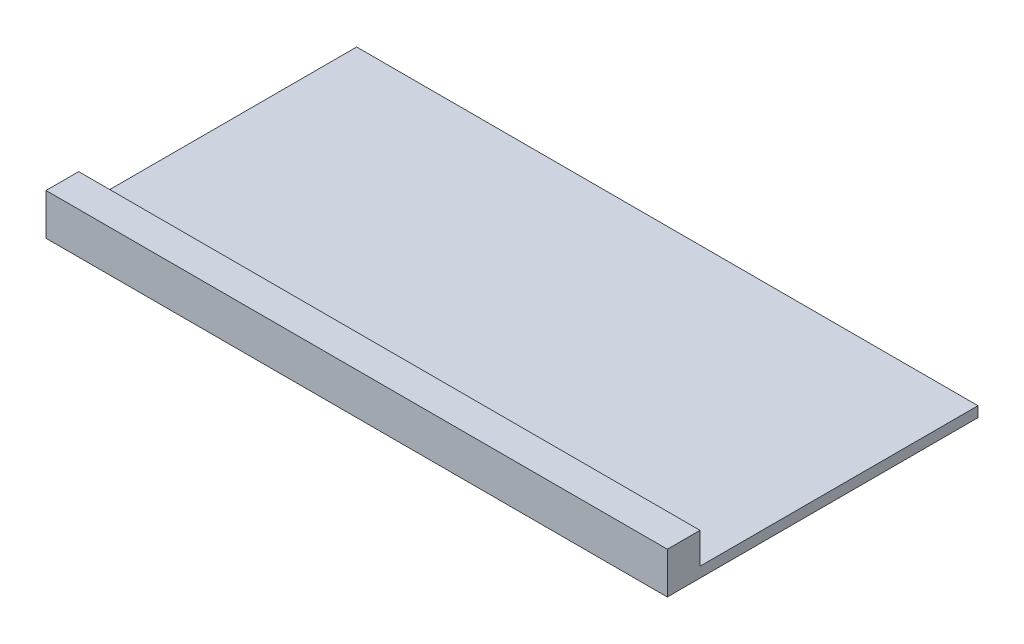
ISO-10303-21;
HEADER;
FILE_DESCRIPTION(('STEP AP214'),'2;1');
FILE_NAME('part.step','',(''),(''),'','','');
FILE_SCHEMA(('AUTOMOTIVE_DESIGN { 1 0 10303 214 1 1 1 1 }'));
ENDSEC;
DATA;
#1=APPLICATION_CONTEXT('core data for automotive mechanical design processes');
#2=APPLICATION_PROTOCOL_DEFINITION('international standard','automotive_design',2000,#1);
#3=PRODUCT_CONTEXT('',#1,'mechanical');
#4=PRODUCT('Part','Part','',(#3));
#5=PRODUCT_RELATED_PRODUCT_CATEGORY('part','',(#4));
#6=PRODUCT_DEFINITION_FORMATION('','',#4);
#7=PRODUCT_DEFINITION_CONTEXT('part definition',#1,'design');
#8=PRODUCT_DEFINITION('design','',#6,#7);
#9=PRODUCT_DEFINITION_SHAPE('','',#8);
#10=(LENGTH_UNIT() NAMED_UNIT(*) SI_UNIT(.MILLI.,.METRE.));
#11=(NAMED_UNIT(*) PLANE_ANGLE_UNIT() SI_UNIT($,.RADIAN.));
#12=(NAMED_UNIT(*) SI_UNIT($,.STERADIAN.) SOLID_ANGLE_UNIT());
#13=UNCERTAINTY_MEASURE_WITH_UNIT(LENGTH_MEASURE(1.E-05),#10,'distance_accuracy_value','');
#14=(GEOMETRIC_REPRESENTATION_CONTEXT(3) GLOBAL_UNCERTAINTY_ASSIGNED_CONTEXT((#13)) GLOBAL_UNIT_ASSIGNED_CONTEXT((#10,
#11,#12)) REPRESENTATION_CONTEXT('',''));
#15=CARTESIAN_POINT('',(0.,0.,0.));
#16=DIRECTION('',(0.,0.,1.));
#17=DIRECTION('',(1.,0.,0.));
#18=AXIS2_PLACEMENT_3D('',#15,#16,#17);
#19=CARTESIAN_POINT('',(-150.,5.,75.0000000000001));
#20=DIRECTION('',(1.,0.,0.));
#21=DIRECTION('',(0.,0.,-1.));
#22=AXIS2_PLACEMENT_3D('',#19,#20,#21);
#23=PLANE('',#22);
#24=DIRECTION('',(0.,0.,1.));
#25=VECTOR('',#24,1.);
#26=CARTESIAN_POINT('',(-150.,0.,75.0000000000001));
#27=LINE('',#26,#25);
#28=CARTESIAN_POINT('',(-150.,0.,-74.9999999999999));
#29=VERTEX_POINT('',#28);
#30=CARTESIAN_POINT('',(-150.,0.,75.0000000000001));
#31=VERTEX_POINT('',#30);
#32=EDGE_CURVE('E92',#29,#31,#27,.T.);
#33=ORIENTED_EDGE('',*,*,#32,.T.);
#34=DIRECTION('',(0.,-1.,0.));
#35=VECTOR('',#34,1.);
#36=CARTESIAN_POINT('',(-150.,5.,75.0000000000001));
#37=LINE('',#36,#35);
#38=CARTESIAN_POINT('',(-150.,20.,75.0000000000001));
#39=VERTEX_POINT('',#38);
#40=EDGE_CURVE('E11',#39,#31,#37,.T.);
#41=ORIENTED_EDGE('',*,*,#40,.F.);
#42=DIRECTION('',(0.,0.,1.));
#43=VECTOR('',#42,1.);
#44=CARTESIAN_POINT('',(-150.,20.,75.0000000000001));
#45=LINE('',#44,#43);
#46=CARTESIAN_POINT('',(-150.,20.,59.2240043778917));
#47=VERTEX_POINT('',#46);
#48=EDGE_CURVE('E129',#47,#39,#45,.T.);
#49=ORIENTED_EDGE('',*,*,#48,.F.);
#50=DIRECTION('',(0.,-1.,0.));
#51=VECTOR('',#50,1.);
#52=CARTESIAN_POINT('',(-150.,20.,59.2240043778917));
#53=LINE('',#52,#51);
#54=CARTESIAN_POINT('',(-150.,5.,59.2240043778917));
#55=VERTEX_POINT('',#54);
#56=EDGE_CURVE('E101',#47,#55,#53,.T.);
#57=ORIENTED_EDGE('',*,*,#56,.T.);
#58=DIRECTION('',(0.,0.,1.));
#59=VECTOR('',#58,1.);
#60=CARTESIAN_POINT('',(-150.,5.,75.0000000000001));
#61=LINE('',#60,#59);
#62=CARTESIAN_POINT('',(-150.,5.,-74.9999999999999));
#63=VERTEX_POINT('',#62);
#64=EDGE_CURVE('E86',#63,#55,#61,.T.);
#65=ORIENTED_EDGE('',*,*,#64,.F.);
#66=DIRECTION('',(0.,-1.,0.));
#67=VECTOR('',#66,1.);
#68=CARTESIAN_POINT('',(-150.,5.,-74.9999999999999));
#69=LINE('',#68,#67);
#70=EDGE_CURVE('E79',#63,#29,#69,.T.);
#71=ORIENTED_EDGE('',*,*,#70,.T.);
#72=EDGE_LOOP('',(#33,#41,#49,#57,#65,#71));
#73=FACE_BOUND('',#72,.T.);
#74=ADVANCED_FACE('F37',(#73),#23,.F.);
#75=CARTESIAN_POINT('',(150.,5.,75.0000000000001));
#76=DIRECTION('',(0.,0.,-1.));
#77=DIRECTION('',(-1.,0.,0.));
#78=AXIS2_PLACEMENT_3D('',#75,#76,#77);
#79=PLANE('',#78);
#80=DIRECTION('',(1.,0.,0.));
#81=VECTOR('',#80,1.);
#82=CARTESIAN_POINT('',(150.,0.,75.0000000000001));
#83=LINE('',#82,#81);
#84=CARTESIAN_POINT('',(150.,0.,75.0000000000001));
#85=VERTEX_POINT('',#84);
#86=EDGE_CURVE('E96',#31,#85,#83,.T.);
#87=ORIENTED_EDGE('',*,*,#86,.T.);
#88=DIRECTION('',(0.,-1.,0.));
#89=VECTOR('',#88,1.);
#90=CARTESIAN_POINT('',(150.,5.,75.0000000000001));
#91=LINE('',#90,#89);
#92=CARTESIAN_POINT('',(150.,20.,75.0000000000001));
#93=VERTEX_POINT('',#92);
#94=EDGE_CURVE('E44',#93,#85,#91,.T.);
#95=ORIENTED_EDGE('',*,*,#94,.F.);
#96=DIRECTION('',(1.,0.,0.));
#97=VECTOR('',#96,1.);
#98=CARTESIAN_POINT('',(-150.,20.,75.0000000000001));
#99=LINE('',#98,#97);
#100=EDGE_CURVE('E121',#39,#93,#99,.T.);
#101=ORIENTED_EDGE('',*,*,#100,.F.);
#102=ORIENTED_EDGE('',*,*,#40,.T.);
#103=EDGE_LOOP('',(#87,#95,#101,#102));
#104=FACE_BOUND('',#103,.T.);
#105=ADVANCED_FACE('F119',(#104),#79,.F.);
#106=CARTESIAN_POINT('',(150.,5.,75.0000000000001));
#107=DIRECTION('',(-1.,0.,0.));
#108=DIRECTION('',(0.,0.,1.));
#109=AXIS2_PLACEMENT_3D('',#106,#107,#108);
#110=PLANE('',#109);
#111=DIRECTION('',(0.,0.,-1.));
#112=VECTOR('',#111,1.);
#113=CARTESIAN_POINT('',(150.,0.,75.0000000000001));
#114=LINE('',#113,#112);
#115=CARTESIAN_POINT('',(150.,0.,-75.));
#116=VERTEX_POINT('',#115);
#117=EDGE_CURVE('E87',#85,#116,#114,.T.);
#118=ORIENTED_EDGE('',*,*,#117,.T.);
#119=DIRECTION('',(0.,-1.,0.));
#120=VECTOR('',#119,1.);
#121=CARTESIAN_POINT('',(150.,5.,-75.));
#122=LINE('',#121,#120);
#123=CARTESIAN_POINT('',(150.,5.,-75.));
#124=VERTEX_POINT('',#123);
#125=EDGE_CURVE('E82',#124,#116,#122,.T.);
#126=ORIENTED_EDGE('',*,*,#125,.F.);
#127=DIRECTION('',(0.,0.,-1.));
#128=VECTOR('',#127,1.);
#129=CARTESIAN_POINT('',(150.,5.,75.0000000000001));
#130=LINE('',#129,#128);
#131=CARTESIAN_POINT('',(150.,5.,59.2240043778917));
#132=VERTEX_POINT('',#131);
#133=EDGE_CURVE('E138',#132,#124,#130,.T.);
#134=ORIENTED_EDGE('',*,*,#133,.F.);
#135=DIRECTION('',(0.,-1.,0.));
#136=VECTOR('',#135,1.);
#137=CARTESIAN_POINT('',(150.,20.,59.2240043778917));
#138=LINE('',#137,#136);
#139=CARTESIAN_POINT('',(150.,20.,59.2240043778917));
#140=VERTEX_POINT('',#139);
#141=EDGE_CURVE('E97',#140,#132,#138,.T.);
#142=ORIENTED_EDGE('',*,*,#141,.F.);
#143=DIRECTION('',(0.,0.,-1.));
#144=VECTOR('',#143,1.);
#145=CARTESIAN_POINT('',(150.,20.,59.2240043778917));
#146=LINE('',#145,#144);
#147=EDGE_CURVE('E115',#93,#140,#146,.T.);
#148=ORIENTED_EDGE('',*,*,#147,.F.);
#149=ORIENTED_EDGE('',*,*,#94,.T.);
#150=EDGE_LOOP('',(#118,#126,#134,#142,#148,#149));
#151=FACE_BOUND('',#150,.T.);
#152=ADVANCED_FACE('F111',(#151),#110,.F.);
#153=CARTESIAN_POINT('',(150.,5.,-75.));
#154=DIRECTION('',(0.,0.,1.));
#155=DIRECTION('',(1.,0.,0.));
#156=AXIS2_PLACEMENT_3D('',#153,#154,#155);
#157=PLANE('',#156);
#158=DIRECTION('',(-1.,0.,0.));
#159=VECTOR('',#158,1.);
#160=CARTESIAN_POINT('',(150.,0.,-75.));
#161=LINE('',#160,#159);
#162=EDGE_CURVE('E76',#116,#29,#161,.T.);
#163=ORIENTED_EDGE('',*,*,#162,.T.);
#164=ORIENTED_EDGE('',*,*,#70,.F.);
#165=DIRECTION('',(-1.,0.,0.));
#166=VECTOR('',#165,1.);
#167=CARTESIAN_POINT('',(150.,5.,-75.));
#168=LINE('',#167,#166);
#169=EDGE_CURVE('E57',#124,#63,#168,.T.);
#170=ORIENTED_EDGE('',*,*,#169,.F.);
#171=ORIENTED_EDGE('',*,*,#125,.T.);
#172=EDGE_LOOP('',(#163,#164,#170,#171));
#173=FACE_BOUND('',#172,.T.);
#174=ADVANCED_FACE('F78',(#173),#157,.F.);
#175=CARTESIAN_POINT('',(0.,5.,0.));
#176=DIRECTION('',(0.,1.,0.));
#177=DIRECTION('',(0.,0.,1.));
#178=AXIS2_PLACEMENT_3D('',#175,#176,#177);
#179=PLANE('',#178);
#180=DIRECTION('',(-1.,0.,0.));
#181=VECTOR('',#180,1.);
#182=CARTESIAN_POINT('',(-150.,5.,59.2240043778917));
#183=LINE('',#182,#181);
#184=EDGE_CURVE('E51',#132,#55,#183,.T.);
#185=ORIENTED_EDGE('',*,*,#184,.F.);
#186=ORIENTED_EDGE('',*,*,#133,.T.);
#187=ORIENTED_EDGE('',*,*,#169,.T.);
#188=ORIENTED_EDGE('',*,*,#64,.T.);
#189=EDGE_LOOP('',(#185,#186,#187,#188));
#190=FACE_BOUND('',#189,.T.);
#191=ADVANCED_FACE('F139',(#190),#179,.T.);
#192=CARTESIAN_POINT('',(0.,0.,0.));
#193=DIRECTION('',(0.,1.,0.));
#194=DIRECTION('',(0.,0.,1.));
#195=AXIS2_PLACEMENT_3D('',#192,#193,#194);
#196=PLANE('',#195);
#197=ORIENTED_EDGE('',*,*,#32,.F.);
#198=ORIENTED_EDGE('',*,*,#162,.F.);
#199=ORIENTED_EDGE('',*,*,#117,.F.);
#200=ORIENTED_EDGE('',*,*,#86,.F.);
#201=EDGE_LOOP('',(#197,#198,#199,#200));
#202=FACE_BOUND('',#201,.T.);
#203=ADVANCED_FACE('F95',(#202),#196,.F.);
#204=CARTESIAN_POINT('',(-150.,20.,59.2240043778917));
#205=DIRECTION('',(0.,0.,1.));
#206=DIRECTION('',(1.,0.,0.));
#207=AXIS2_PLACEMENT_3D('',#204,#205,#206);
#208=PLANE('',#207);
#209=ORIENTED_EDGE('',*,*,#184,.T.);
#210=ORIENTED_EDGE('',*,*,#56,.F.);
#211=DIRECTION('',(-1.,0.,0.));
#212=VECTOR('',#211,1.);
#213=CARTESIAN_POINT('',(-150.,20.,59.2240043778917));
#214=LINE('',#213,#212);
#215=EDGE_CURVE('E131',#140,#47,#214,.T.);
#216=ORIENTED_EDGE('',*,*,#215,.F.);
#217=ORIENTED_EDGE('',*,*,#141,.T.);
#218=EDGE_LOOP('',(#209,#210,#216,#217));
#219=FACE_BOUND('',#218,.T.);
#220=ADVANCED_FACE('F142',(#219),#208,.F.);
#221=CARTESIAN_POINT('',(0.,20.,0.));
#222=DIRECTION('',(0.,-1.,0.));
#223=DIRECTION('',(0.,0.,-1.));
#224=AXIS2_PLACEMENT_3D('',#221,#222,#223);
#225=PLANE('',#224);
#226=ORIENTED_EDGE('',*,*,#48,.T.);
#227=ORIENTED_EDGE('',*,*,#100,.T.);
#228=ORIENTED_EDGE('',*,*,#147,.T.);
#229=ORIENTED_EDGE('',*,*,#215,.T.);
#230=EDGE_LOOP('',(#226,#227,#228,#229));
#231=FACE_BOUND('',#230,.T.);
#232=ADVANCED_FACE('F126',(#231),#225,.F.);
#233=CLOSED_SHELL('',(#74,#105,#152,#174,#191,#203,#220,#232));
#234=MANIFOLD_SOLID_BREP('B2',#233);
#235=ADVANCED_BREP_SHAPE_REPRESENTATION('',(#18,#234),#14);
#236=SHAPE_DEFINITION_REPRESENTATION(#9,#235);
ENDSEC;
END-ISO-10303-21;
